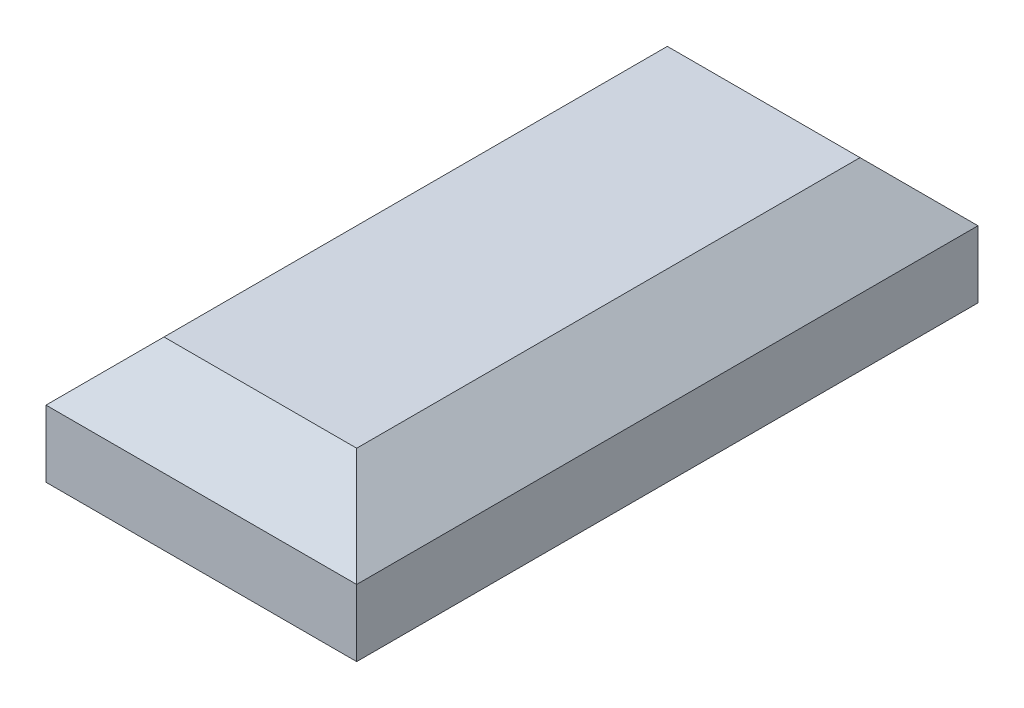
ISO-10303-21;
HEADER;
FILE_DESCRIPTION(('STEP AP214'),'2;1');
FILE_NAME('part.step','',(''),(''),'','','');
FILE_SCHEMA(('AUTOMOTIVE_DESIGN { 1 0 10303 214 1 1 1 1 }'));
ENDSEC;
DATA;
#1=APPLICATION_CONTEXT('core data for automotive mechanical design processes');
#2=APPLICATION_PROTOCOL_DEFINITION('international standard','automotive_design',2000,#1);
#3=PRODUCT_CONTEXT('',#1,'mechanical');
#4=PRODUCT('Part','Part','',(#3));
#5=PRODUCT_RELATED_PRODUCT_CATEGORY('part','',(#4));
#6=PRODUCT_DEFINITION_FORMATION('','',#4);
#7=PRODUCT_DEFINITION_CONTEXT('part definition',#1,'design');
#8=PRODUCT_DEFINITION('design','',#6,#7);
#9=PRODUCT_DEFINITION_SHAPE('','',#8);
#10=(LENGTH_UNIT() NAMED_UNIT(*) SI_UNIT(.MILLI.,.METRE.));
#11=(NAMED_UNIT(*) PLANE_ANGLE_UNIT() SI_UNIT($,.RADIAN.));
#12=(NAMED_UNIT(*) SI_UNIT($,.STERADIAN.) SOLID_ANGLE_UNIT());
#13=UNCERTAINTY_MEASURE_WITH_UNIT(LENGTH_MEASURE(1.E-05),#10,'distance_accuracy_value','');
#14=(GEOMETRIC_REPRESENTATION_CONTEXT(3) GLOBAL_UNCERTAINTY_ASSIGNED_CONTEXT((#13)) GLOBAL_UNIT_ASSIGNED_CONTEXT((#10,
#11,#12)) REPRESENTATION_CONTEXT('',''));
#15=CARTESIAN_POINT('',(0.,0.,0.));
#16=DIRECTION('',(0.,0.,1.));
#17=DIRECTION('',(1.,0.,0.));
#18=AXIS2_PLACEMENT_3D('',#15,#16,#17);
#19=CARTESIAN_POINT('',(0.681967213114738,0.,7.9));
#20=DIRECTION('',(0.,1.,0.));
#21=DIRECTION('',(0.,0.,1.));
#22=AXIS2_PLACEMENT_3D('',#19,#20,#21);
#23=PLANE('',#22);
#24=DIRECTION('',(1.,0.,0.));
#25=VECTOR('',#24,1.);
#26=CARTESIAN_POINT('',(0.681967213114738,0.,-7.9));
#27=LINE('',#26,#25);
#28=CARTESIAN_POINT('',(0.681967213114738,0.,-7.9));
#29=VERTEX_POINT('',#28);
#30=CARTESIAN_POINT('',(8.58196721311474,0.,-7.9));
#31=VERTEX_POINT('',#30);
#32=EDGE_CURVE('E177',#29,#31,#27,.T.);
#33=ORIENTED_EDGE('',*,*,#32,.T.);
#34=DIRECTION('',(0.,0.,-1.));
#35=VECTOR('',#34,1.);
#36=CARTESIAN_POINT('',(8.58196721311474,0.,7.9));
#37=LINE('',#36,#35);
#38=CARTESIAN_POINT('',(8.58196721311474,0.,7.9));
#39=VERTEX_POINT('',#38);
#40=EDGE_CURVE('E175',#39,#31,#37,.T.);
#41=ORIENTED_EDGE('',*,*,#40,.F.);
#42=DIRECTION('',(1.,0.,0.));
#43=VECTOR('',#42,1.);
#44=CARTESIAN_POINT('',(0.681967213114738,0.,7.9));
#45=LINE('',#44,#43);
#46=CARTESIAN_POINT('',(0.681967213114738,0.,7.9));
#47=VERTEX_POINT('',#46);
#48=EDGE_CURVE('E170',#47,#39,#45,.T.);
#49=ORIENTED_EDGE('',*,*,#48,.F.);
#50=DIRECTION('',(0.,0.,-1.));
#51=VECTOR('',#50,1.);
#52=CARTESIAN_POINT('',(0.681967213114738,0.,7.9));
#53=LINE('',#52,#51);
#54=EDGE_CURVE('E182',#47,#29,#53,.T.);
#55=ORIENTED_EDGE('',*,*,#54,.T.);
#56=EDGE_LOOP('',(#33,#41,#49,#55));
#57=FACE_BOUND('',#56,.T.);
#58=DIRECTION('',(1.,0.,0.));
#59=VECTOR('',#58,1.);
#60=CARTESIAN_POINT('',(0.,0.,-6.7));
#61=LINE('',#60,#59);
#62=CARTESIAN_POINT('',(1.88196721311474,0.,-6.7));
#63=VERTEX_POINT('',#62);
#64=CARTESIAN_POINT('',(7.38196721311474,0.,-6.7));
#65=VERTEX_POINT('',#64);
#66=EDGE_CURVE('E148',#63,#65,#61,.T.);
#67=ORIENTED_EDGE('',*,*,#66,.F.);
#68=DIRECTION('',(0.,0.,-1.));
#69=VECTOR('',#68,1.);
#70=CARTESIAN_POINT('',(1.88196721311474,0.,7.9));
#71=LINE('',#70,#69);
#72=CARTESIAN_POINT('',(1.88196721311474,0.,6.7));
#73=VERTEX_POINT('',#72);
#74=EDGE_CURVE('E147',#73,#63,#71,.T.);
#75=ORIENTED_EDGE('',*,*,#74,.F.);
#76=DIRECTION('',(1.,0.,0.));
#77=VECTOR('',#76,1.);
#78=CARTESIAN_POINT('',(0.,0.,6.7));
#79=LINE('',#78,#77);
#80=CARTESIAN_POINT('',(7.38196721311474,0.,6.7));
#81=VERTEX_POINT('',#80);
#82=EDGE_CURVE('E154',#73,#81,#79,.T.);
#83=ORIENTED_EDGE('',*,*,#82,.T.);
#84=DIRECTION('',(0.,0.,-1.));
#85=VECTOR('',#84,1.);
#86=CARTESIAN_POINT('',(7.38196721311474,0.,7.9));
#87=LINE('',#86,#85);
#88=EDGE_CURVE('E159',#81,#65,#87,.T.);
#89=ORIENTED_EDGE('',*,*,#88,.T.);
#90=EDGE_LOOP('',(#67,#75,#83,#89));
#91=FACE_BOUND('',#90,.T.);
#92=ADVANCED_FACE('F43',(#57,#91),#23,.F.);
#93=CARTESIAN_POINT('',(0.681967213114738,0.,7.9));
#94=DIRECTION('',(1.,0.,0.));
#95=DIRECTION('',(0.,0.,-1.));
#96=AXIS2_PLACEMENT_3D('',#93,#94,#95);
#97=PLANE('',#96);
#98=DIRECTION('',(0.,-1.,0.));
#99=VECTOR('',#98,1.);
#100=CARTESIAN_POINT('',(0.681967213114738,0.,7.9));
#101=LINE('',#100,#99);
#102=CARTESIAN_POINT('',(0.681967213114738,1.7,7.9));
#103=VERTEX_POINT('',#102);
#104=EDGE_CURVE('E168',#103,#47,#101,.T.);
#105=ORIENTED_EDGE('',*,*,#104,.F.);
#106=DIRECTION('',(0.,0.,-1.));
#107=VECTOR('',#106,1.);
#108=CARTESIAN_POINT('',(0.681967213114738,1.7,7.9));
#109=LINE('',#108,#107);
#110=CARTESIAN_POINT('',(0.681967213114738,1.7,-7.9));
#111=VERTEX_POINT('',#110);
#112=EDGE_CURVE('E11',#103,#111,#109,.T.);
#113=ORIENTED_EDGE('',*,*,#112,.T.);
#114=DIRECTION('',(0.,-1.,0.));
#115=VECTOR('',#114,1.);
#116=CARTESIAN_POINT('',(0.681967213114738,0.,-7.9));
#117=LINE('',#116,#115);
#118=EDGE_CURVE('E162',#111,#29,#117,.T.);
#119=ORIENTED_EDGE('',*,*,#118,.T.);
#120=ORIENTED_EDGE('',*,*,#54,.F.);
#121=EDGE_LOOP('',(#105,#113,#119,#120));
#122=FACE_BOUND('',#121,.T.);
#123=ADVANCED_FACE('F232',(#122),#97,.F.);
#124=CARTESIAN_POINT('',(8.58196721311474,0.,7.9));
#125=DIRECTION('',(-1.,0.,0.));
#126=DIRECTION('',(0.,0.,1.));
#127=AXIS2_PLACEMENT_3D('',#124,#125,#126);
#128=PLANE('',#127);
#129=DIRECTION('',(0.,1.,0.));
#130=VECTOR('',#129,1.);
#131=CARTESIAN_POINT('',(8.58196721311474,0.,-7.9));
#132=LINE('',#131,#130);
#133=CARTESIAN_POINT('',(8.58196721311474,1.7,-7.9));
#134=VERTEX_POINT('',#133);
#135=EDGE_CURVE('E171',#31,#134,#132,.T.);
#136=ORIENTED_EDGE('',*,*,#135,.T.);
#137=DIRECTION('',(0.,0.,1.));
#138=VECTOR('',#137,1.);
#139=CARTESIAN_POINT('',(8.58196721311474,1.7,7.9));
#140=LINE('',#139,#138);
#141=CARTESIAN_POINT('',(8.58196721311474,1.7,7.9));
#142=VERTEX_POINT('',#141);
#143=EDGE_CURVE('E68',#134,#142,#140,.T.);
#144=ORIENTED_EDGE('',*,*,#143,.T.);
#145=DIRECTION('',(0.,1.,0.));
#146=VECTOR('',#145,1.);
#147=CARTESIAN_POINT('',(8.58196721311474,0.,7.9));
#148=LINE('',#147,#146);
#149=EDGE_CURVE('E173',#39,#142,#148,.T.);
#150=ORIENTED_EDGE('',*,*,#149,.F.);
#151=ORIENTED_EDGE('',*,*,#40,.T.);
#152=EDGE_LOOP('',(#136,#144,#150,#151));
#153=FACE_BOUND('',#152,.T.);
#154=ADVANCED_FACE('F225',(#153),#128,.F.);
#155=CARTESIAN_POINT('',(0.681967213114738,3.2,7.9));
#156=DIRECTION('',(0.,-1.,0.));
#157=DIRECTION('',(1.,0.,0.));
#158=AXIS2_PLACEMENT_3D('',#155,#156,#157);
#159=PLANE('',#158);
#160=DIRECTION('',(0.,0.,-1.));
#161=VECTOR('',#160,1.);
#162=CARTESIAN_POINT('',(7.08196721311473,3.2,7.9));
#163=LINE('',#162,#161);
#164=CARTESIAN_POINT('',(7.08196721311473,3.2,6.39999999999999));
#165=VERTEX_POINT('',#164);
#166=CARTESIAN_POINT('',(7.08196721311473,3.2,-6.39999999999999));
#167=VERTEX_POINT('',#166);
#168=EDGE_CURVE('E189',#165,#167,#163,.T.);
#169=ORIENTED_EDGE('',*,*,#168,.T.);
#170=DIRECTION('',(-1.,0.,0.));
#171=VECTOR('',#170,1.);
#172=CARTESIAN_POINT('',(0.681967213114738,3.2,-6.39999999999999));
#173=LINE('',#172,#171);
#174=CARTESIAN_POINT('',(2.18196721311474,3.2,-6.39999999999999));
#175=VERTEX_POINT('',#174);
#176=EDGE_CURVE('E191',#167,#175,#173,.T.);
#177=ORIENTED_EDGE('',*,*,#176,.T.);
#178=DIRECTION('',(0.,0.,1.));
#179=VECTOR('',#178,1.);
#180=CARTESIAN_POINT('',(2.18196721311474,3.2,7.9));
#181=LINE('',#180,#179);
#182=CARTESIAN_POINT('',(2.18196721311474,3.2,6.39999999999999));
#183=VERTEX_POINT('',#182);
#184=EDGE_CURVE('E185',#175,#183,#181,.T.);
#185=ORIENTED_EDGE('',*,*,#184,.T.);
#186=DIRECTION('',(1.,0.,0.));
#187=VECTOR('',#186,1.);
#188=CARTESIAN_POINT('',(0.681967213114738,3.2,6.39999999999999));
#189=LINE('',#188,#187);
#190=EDGE_CURVE('E187',#183,#165,#189,.T.);
#191=ORIENTED_EDGE('',*,*,#190,.T.);
#192=EDGE_LOOP('',(#169,#177,#185,#191));
#193=FACE_BOUND('',#192,.T.);
#194=ADVANCED_FACE('F214',(#193),#159,.F.);
#195=CARTESIAN_POINT('',(0.,0.,7.9));
#196=DIRECTION('',(0.,0.,-1.));
#197=DIRECTION('',(-1.,0.,0.));
#198=AXIS2_PLACEMENT_3D('',#195,#196,#197);
#199=PLANE('',#198);
#200=ORIENTED_EDGE('',*,*,#149,.T.);
#201=DIRECTION('',(-1.,0.,0.));
#202=VECTOR('',#201,1.);
#203=CARTESIAN_POINT('',(0.,1.7,7.9));
#204=LINE('',#203,#202);
#205=EDGE_CURVE('E53',#142,#103,#204,.T.);
#206=ORIENTED_EDGE('',*,*,#205,.T.);
#207=ORIENTED_EDGE('',*,*,#104,.T.);
#208=ORIENTED_EDGE('',*,*,#48,.T.);
#209=EDGE_LOOP('',(#200,#206,#207,#208));
#210=FACE_BOUND('',#209,.T.);
#211=ADVANCED_FACE('F233',(#210),#199,.F.);
#212=CARTESIAN_POINT('',(0.,0.,-7.9));
#213=DIRECTION('',(0.,0.,-1.));
#214=DIRECTION('',(-1.,0.,0.));
#215=AXIS2_PLACEMENT_3D('',#212,#213,#214);
#216=PLANE('',#215);
#217=ORIENTED_EDGE('',*,*,#118,.F.);
#218=DIRECTION('',(1.,0.,0.));
#219=VECTOR('',#218,1.);
#220=CARTESIAN_POINT('',(8.58196721311474,1.7,-7.9));
#221=LINE('',#220,#219);
#222=EDGE_CURVE('E194',#111,#134,#221,.T.);
#223=ORIENTED_EDGE('',*,*,#222,.T.);
#224=ORIENTED_EDGE('',*,*,#135,.F.);
#225=ORIENTED_EDGE('',*,*,#32,.F.);
#226=EDGE_LOOP('',(#217,#223,#224,#225));
#227=FACE_BOUND('',#226,.T.);
#228=ADVANCED_FACE('F223',(#227),#216,.T.);
#229=CARTESIAN_POINT('',(1.88196721311474,0.,7.9));
#230=DIRECTION('',(1.,0.,0.));
#231=DIRECTION('',(0.,0.,-1.));
#232=AXIS2_PLACEMENT_3D('',#229,#230,#231);
#233=PLANE('',#232);
#234=DIRECTION('',(0.,-1.,0.));
#235=VECTOR('',#234,1.);
#236=CARTESIAN_POINT('',(1.88196721311474,0.,-6.7));
#237=LINE('',#236,#235);
#238=CARTESIAN_POINT('',(1.88196721311474,2.,-6.7));
#239=VERTEX_POINT('',#238);
#240=EDGE_CURVE('E127',#239,#63,#237,.T.);
#241=ORIENTED_EDGE('',*,*,#240,.F.);
#242=DIRECTION('',(0.,0.,-1.));
#243=VECTOR('',#242,1.);
#244=CARTESIAN_POINT('',(1.88196721311474,2.,7.9));
#245=LINE('',#244,#243);
#246=CARTESIAN_POINT('',(1.88196721311474,2.,6.7));
#247=VERTEX_POINT('',#246);
#248=EDGE_CURVE('E137',#247,#239,#245,.T.);
#249=ORIENTED_EDGE('',*,*,#248,.F.);
#250=DIRECTION('',(0.,-1.,0.));
#251=VECTOR('',#250,1.);
#252=CARTESIAN_POINT('',(1.88196721311474,0.,6.7));
#253=LINE('',#252,#251);
#254=EDGE_CURVE('E134',#247,#73,#253,.T.);
#255=ORIENTED_EDGE('',*,*,#254,.T.);
#256=ORIENTED_EDGE('',*,*,#74,.T.);
#257=EDGE_LOOP('',(#241,#249,#255,#256));
#258=FACE_BOUND('',#257,.T.);
#259=ADVANCED_FACE('F145',(#258),#233,.T.);
#260=CARTESIAN_POINT('',(7.38196721311474,0.,7.9));
#261=DIRECTION('',(-1.,0.,0.));
#262=DIRECTION('',(0.,0.,1.));
#263=AXIS2_PLACEMENT_3D('',#260,#261,#262);
#264=PLANE('',#263);
#265=DIRECTION('',(0.,1.,0.));
#266=VECTOR('',#265,1.);
#267=CARTESIAN_POINT('',(7.38196721311474,0.,-6.7));
#268=LINE('',#267,#266);
#269=CARTESIAN_POINT('',(7.38196721311474,2.,-6.7));
#270=VERTEX_POINT('',#269);
#271=EDGE_CURVE('E130',#65,#270,#268,.T.);
#272=ORIENTED_EDGE('',*,*,#271,.F.);
#273=ORIENTED_EDGE('',*,*,#88,.F.);
#274=DIRECTION('',(0.,1.,0.));
#275=VECTOR('',#274,1.);
#276=CARTESIAN_POINT('',(7.38196721311474,0.,6.7));
#277=LINE('',#276,#275);
#278=CARTESIAN_POINT('',(7.38196721311474,2.,6.7));
#279=VERTEX_POINT('',#278);
#280=EDGE_CURVE('E157',#81,#279,#277,.T.);
#281=ORIENTED_EDGE('',*,*,#280,.T.);
#282=DIRECTION('',(0.,0.,-1.));
#283=VECTOR('',#282,1.);
#284=CARTESIAN_POINT('',(7.38196721311474,2.,7.9));
#285=LINE('',#284,#283);
#286=EDGE_CURVE('E143',#279,#270,#285,.T.);
#287=ORIENTED_EDGE('',*,*,#286,.T.);
#288=EDGE_LOOP('',(#272,#273,#281,#287));
#289=FACE_BOUND('',#288,.T.);
#290=ADVANCED_FACE('F283',(#289),#264,.T.);
#291=CARTESIAN_POINT('',(0.681967213114738,2.,7.9));
#292=DIRECTION('',(0.,-1.,0.));
#293=DIRECTION('',(1.,0.,0.));
#294=AXIS2_PLACEMENT_3D('',#291,#292,#293);
#295=PLANE('',#294);
#296=DIRECTION('',(-1.,0.,0.));
#297=VECTOR('',#296,1.);
#298=CARTESIAN_POINT('',(0.,2.,-6.7));
#299=LINE('',#298,#297);
#300=EDGE_CURVE('E123',#270,#239,#299,.T.);
#301=ORIENTED_EDGE('',*,*,#300,.F.);
#302=ORIENTED_EDGE('',*,*,#286,.F.);
#303=DIRECTION('',(-1.,0.,0.));
#304=VECTOR('',#303,1.);
#305=CARTESIAN_POINT('',(0.,2.,6.7));
#306=LINE('',#305,#304);
#307=EDGE_CURVE('E140',#279,#247,#306,.T.);
#308=ORIENTED_EDGE('',*,*,#307,.T.);
#309=ORIENTED_EDGE('',*,*,#248,.T.);
#310=EDGE_LOOP('',(#301,#302,#308,#309));
#311=FACE_BOUND('',#310,.T.);
#312=ADVANCED_FACE('F138',(#311),#295,.T.);
#313=CARTESIAN_POINT('',(0.,0.,6.7));
#314=DIRECTION('',(0.,0.,-1.));
#315=DIRECTION('',(-1.,0.,0.));
#316=AXIS2_PLACEMENT_3D('',#313,#314,#315);
#317=PLANE('',#316);
#318=ORIENTED_EDGE('',*,*,#254,.F.);
#319=ORIENTED_EDGE('',*,*,#307,.F.);
#320=ORIENTED_EDGE('',*,*,#280,.F.);
#321=ORIENTED_EDGE('',*,*,#82,.F.);
#322=EDGE_LOOP('',(#318,#319,#320,#321));
#323=FACE_BOUND('',#322,.T.);
#324=ADVANCED_FACE('F274',(#323),#317,.T.);
#325=CARTESIAN_POINT('',(0.,0.,-6.7));
#326=DIRECTION('',(0.,0.,-1.));
#327=DIRECTION('',(-1.,0.,0.));
#328=AXIS2_PLACEMENT_3D('',#325,#326,#327);
#329=PLANE('',#328);
#330=ORIENTED_EDGE('',*,*,#240,.T.);
#331=ORIENTED_EDGE('',*,*,#66,.T.);
#332=ORIENTED_EDGE('',*,*,#271,.T.);
#333=ORIENTED_EDGE('',*,*,#300,.T.);
#334=EDGE_LOOP('',(#330,#331,#332,#333));
#335=FACE_BOUND('',#334,.T.);
#336=ADVANCED_FACE('F125',(#335),#329,.F.);
#337=CARTESIAN_POINT('',(0.,1.7,7.9));
#338=DIRECTION('',(0.,-0.707106781186549,-0.707106781186546));
#339=DIRECTION('',(-1.,0.,0.));
#340=AXIS2_PLACEMENT_3D('',#337,#338,#339);
#341=PLANE('',#340);
#342=DIRECTION('',(0.577350269189626,0.577350269189624,-0.577350269189626));
#343=VECTOR('',#342,1.);
#344=CARTESIAN_POINT('',(0.681967213114738,1.7,7.9));
#345=LINE('',#344,#343);
#346=EDGE_CURVE('E152',#103,#183,#345,.T.);
#347=ORIENTED_EDGE('',*,*,#346,.F.);
#348=ORIENTED_EDGE('',*,*,#205,.F.);
#349=DIRECTION('',(-0.577350269189626,0.577350269189624,-0.577350269189626));
#350=VECTOR('',#349,1.);
#351=CARTESIAN_POINT('',(5.72131147540982,4.56065573770491,5.03934426229508));
#352=LINE('',#351,#350);
#353=EDGE_CURVE('E48',#165,#142,#352,.F.);
#354=ORIENTED_EDGE('',*,*,#353,.F.);
#355=ORIENTED_EDGE('',*,*,#190,.F.);
#356=EDGE_LOOP('',(#347,#348,#354,#355));
#357=FACE_BOUND('',#356,.T.);
#358=ADVANCED_FACE('F46',(#357),#341,.F.);
#359=CARTESIAN_POINT('',(7.08196721311473,3.2,7.9));
#360=DIRECTION('',(-0.707106781186546,-0.707106781186549,0.));
#361=DIRECTION('',(0.,0.,-1.));
#362=AXIS2_PLACEMENT_3D('',#359,#360,#361);
#363=PLANE('',#362);
#364=ORIENTED_EDGE('',*,*,#353,.T.);
#365=ORIENTED_EDGE('',*,*,#143,.F.);
#366=DIRECTION('',(0.577350269189626,-0.577350269189624,-0.577350269189626));
#367=VECTOR('',#366,1.);
#368=CARTESIAN_POINT('',(2.31530054644806,7.96666666666666,-1.63333333333332));
#369=LINE('',#368,#367);
#370=EDGE_CURVE('E201',#167,#134,#369,.T.);
#371=ORIENTED_EDGE('',*,*,#370,.F.);
#372=ORIENTED_EDGE('',*,*,#168,.F.);
#373=EDGE_LOOP('',(#364,#365,#371,#372));
#374=FACE_BOUND('',#373,.T.);
#375=ADVANCED_FACE('F264',(#374),#363,.F.);
#376=CARTESIAN_POINT('',(0.681967213114738,1.7,7.9));
#377=DIRECTION('',(0.707106781186546,-0.707106781186549,0.));
#378=DIRECTION('',(0.,0.,-1.));
#379=AXIS2_PLACEMENT_3D('',#376,#377,#378);
#380=PLANE('',#379);
#381=ORIENTED_EDGE('',*,*,#346,.T.);
#382=ORIENTED_EDGE('',*,*,#184,.F.);
#383=DIRECTION('',(0.577350269189626,0.577350269189624,0.577350269189626));
#384=VECTOR('',#383,1.);
#385=CARTESIAN_POINT('',(5.94863387978142,6.96666666666666,-2.63333333333332));
#386=LINE('',#385,#384);
#387=EDGE_CURVE('E199',#111,#175,#386,.T.);
#388=ORIENTED_EDGE('',*,*,#387,.F.);
#389=ORIENTED_EDGE('',*,*,#112,.F.);
#390=EDGE_LOOP('',(#381,#382,#388,#389));
#391=FACE_BOUND('',#390,.T.);
#392=ADVANCED_FACE('F207',(#391),#380,.F.);
#393=CARTESIAN_POINT('',(0.681967213114738,3.2,-6.39999999999999));
#394=DIRECTION('',(0.,0.707106781186549,-0.707106781186546));
#395=DIRECTION('',(1.,0.,0.));
#396=AXIS2_PLACEMENT_3D('',#393,#394,#395);
#397=PLANE('',#396);
#398=ORIENTED_EDGE('',*,*,#370,.T.);
#399=ORIENTED_EDGE('',*,*,#222,.F.);
#400=ORIENTED_EDGE('',*,*,#387,.T.);
#401=ORIENTED_EDGE('',*,*,#176,.F.);
#402=EDGE_LOOP('',(#398,#399,#400,#401));
#403=FACE_BOUND('',#402,.T.);
#404=ADVANCED_FACE('F218',(#403),#397,.T.);
#405=CLOSED_SHELL('',(#92,#123,#154,#194,#211,#228,#259,#290,#312,#324,#336,#358,#375,#392,#404));
#406=MANIFOLD_SOLID_BREP('B2',#405);
#407=ADVANCED_BREP_SHAPE_REPRESENTATION('',(#18,#406),#14);
#408=SHAPE_DEFINITION_REPRESENTATION(#9,#407);
ENDSEC;
END-ISO-10303-21;
